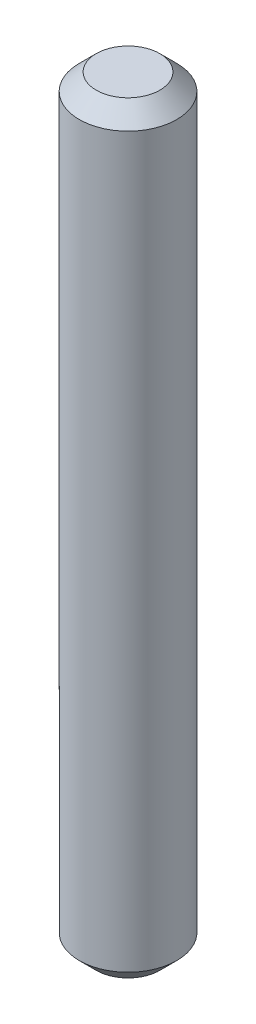
ISO-10303-21;
HEADER;
FILE_DESCRIPTION(('STEP AP214'),'2;1');
FILE_NAME('part.step','',(''),(''),'','','');
FILE_SCHEMA(('AUTOMOTIVE_DESIGN { 1 0 10303 214 1 1 1 1 }'));
ENDSEC;
DATA;
#1=APPLICATION_CONTEXT('core data for automotive mechanical design processes');
#2=APPLICATION_PROTOCOL_DEFINITION('international standard','automotive_design',2000,#1);
#3=PRODUCT_CONTEXT('',#1,'mechanical');
#4=PRODUCT('Part','Part','',(#3));
#5=PRODUCT_RELATED_PRODUCT_CATEGORY('part','',(#4));
#6=PRODUCT_DEFINITION_FORMATION('','',#4);
#7=PRODUCT_DEFINITION_CONTEXT('part definition',#1,'design');
#8=PRODUCT_DEFINITION('design','',#6,#7);
#9=PRODUCT_DEFINITION_SHAPE('','',#8);
#10=(LENGTH_UNIT() NAMED_UNIT(*) SI_UNIT(.MILLI.,.METRE.));
#11=(NAMED_UNIT(*) PLANE_ANGLE_UNIT() SI_UNIT($,.RADIAN.));
#12=(NAMED_UNIT(*) SI_UNIT($,.STERADIAN.) SOLID_ANGLE_UNIT());
#13=UNCERTAINTY_MEASURE_WITH_UNIT(LENGTH_MEASURE(1.E-05),#10,'distance_accuracy_value','');
#14=(GEOMETRIC_REPRESENTATION_CONTEXT(3) GLOBAL_UNCERTAINTY_ASSIGNED_CONTEXT((#13)) GLOBAL_UNIT_ASSIGNED_CONTEXT((#10,
#11,#12)) REPRESENTATION_CONTEXT('',''));
#15=CARTESIAN_POINT('',(0.,0.,0.));
#16=DIRECTION('',(0.,0.,1.));
#17=DIRECTION('',(1.,0.,0.));
#18=AXIS2_PLACEMENT_3D('',#15,#16,#17);
#19=CARTESIAN_POINT('',(0.,22.5,0.));
#20=DIRECTION('',(0.,-1.,0.));
#21=DIRECTION('',(0.,0.,-1.));
#22=AXIS2_PLACEMENT_3D('',#19,#20,#21);
#23=CYLINDRICAL_SURFACE('',#22,2.875);
#24=CARTESIAN_POINT('',(0.,21.5,0.));
#25=DIRECTION('',(0.,1.,0.));
#26=DIRECTION('',(0.,0.,1.));
#27=AXIS2_PLACEMENT_3D('',#24,#25,#26);
#28=CIRCLE('',#27,2.875);
#29=CARTESIAN_POINT('',(0.,21.5,-2.875));
#30=VERTEX_POINT('',#29);
#31=EDGE_CURVE('E49',#30,#30,#28,.F.);
#32=CARTESIAN_POINT('',(0.,-21.5,0.));
#33=DIRECTION('',(0.,1.,0.));
#34=DIRECTION('',(0.,0.,1.));
#35=AXIS2_PLACEMENT_3D('',#32,#33,#34);
#36=CIRCLE('',#35,2.875);
#37=CARTESIAN_POINT('',(0.,-21.5,-2.875));
#38=VERTEX_POINT('',#37);
#39=EDGE_CURVE('E56',#38,#38,#36,.T.);
#40=CARTESIAN_POINT('',(0.,21.5,-2.875));
#41=CARTESIAN_POINT('',(0.,21.0520833333333,-2.875));
#42=CARTESIAN_POINT('',(0.,20.6041666666667,-2.875));
#43=CARTESIAN_POINT('',(0.,19.7083333333334,-2.875));
#44=CARTESIAN_POINT('',(0.,19.2604166666667,-2.875));
#45=CARTESIAN_POINT('',(0.,18.3645833333333,-2.875));
#46=CARTESIAN_POINT('',(0.,17.9166666666667,-2.875));
#47=CARTESIAN_POINT('',(0.,17.0208333333334,-2.875));
#48=CARTESIAN_POINT('',(0.,16.5729166666667,-2.875));
#49=CARTESIAN_POINT('',(0.,15.6770833333334,-2.875));
#50=CARTESIAN_POINT('',(0.,15.2291666666667,-2.875));
#51=CARTESIAN_POINT('',(0.,14.3333333333334,-2.875));
#52=CARTESIAN_POINT('',(0.,13.8854166666667,-2.875));
#53=CARTESIAN_POINT('',(0.,12.9895833333334,-2.875));
#54=CARTESIAN_POINT('',(0.,12.5416666666667,-2.875));
#55=CARTESIAN_POINT('',(0.,11.6458333333334,-2.875));
#56=CARTESIAN_POINT('',(0.,11.1979166666667,-2.875));
#57=CARTESIAN_POINT('',(0.,10.3020833333334,-2.875));
#58=CARTESIAN_POINT('',(0.,9.85416666666669,-2.875));
#59=CARTESIAN_POINT('',(0.,8.95833333333336,-2.875));
#60=CARTESIAN_POINT('',(0.,8.51041666666669,-2.875));
#61=CARTESIAN_POINT('',(0.,7.61458333333336,-2.875));
#62=CARTESIAN_POINT('',(0.,7.16666666666669,-2.875));
#63=CARTESIAN_POINT('',(0.,6.27083333333336,-2.875));
#64=CARTESIAN_POINT('',(0.,5.82291666666669,-2.875));
#65=CARTESIAN_POINT('',(0.,4.92708333333336,-2.875));
#66=CARTESIAN_POINT('',(0.,4.47916666666669,-2.875));
#67=CARTESIAN_POINT('',(0.,3.58333333333336,-2.875));
#68=CARTESIAN_POINT('',(0.,3.13541666666669,-2.875));
#69=CARTESIAN_POINT('',(0.,2.23958333333336,-2.875));
#70=CARTESIAN_POINT('',(0.,1.79166666666669,-2.875));
#71=CARTESIAN_POINT('',(0.,0.895833333333358,-2.875));
#72=CARTESIAN_POINT('',(0.,0.447916666666691,-2.875));
#73=CARTESIAN_POINT('',(0.,-0.447916666666643,-2.875));
#74=CARTESIAN_POINT('',(0.,-0.89583333333331,-2.875));
#75=CARTESIAN_POINT('',(0.,-1.79166666666664,-2.875));
#76=CARTESIAN_POINT('',(0.,-2.23958333333331,-2.875));
#77=CARTESIAN_POINT('',(0.,-3.13541666666664,-2.875));
#78=CARTESIAN_POINT('',(0.,-3.58333333333331,-2.875));
#79=CARTESIAN_POINT('',(0.,-4.47916666666664,-2.875));
#80=CARTESIAN_POINT('',(0.,-4.92708333333331,-2.875));
#81=CARTESIAN_POINT('',(0.,-5.82291666666664,-2.875));
#82=CARTESIAN_POINT('',(0.,-6.27083333333331,-2.875));
#83=CARTESIAN_POINT('',(0.,-7.16666666666664,-2.875));
#84=CARTESIAN_POINT('',(0.,-7.61458333333331,-2.875));
#85=CARTESIAN_POINT('',(0.,-8.51041666666664,-2.875));
#86=CARTESIAN_POINT('',(0.,-8.9583333333333,-2.875));
#87=CARTESIAN_POINT('',(0.,-9.85416666666664,-2.875));
#88=CARTESIAN_POINT('',(0.,-10.3020833333333,-2.875));
#89=CARTESIAN_POINT('',(0.,-11.1979166666666,-2.875));
#90=CARTESIAN_POINT('',(0.,-11.6458333333333,-2.875));
#91=CARTESIAN_POINT('',(0.,-12.5416666666666,-2.875));
#92=CARTESIAN_POINT('',(0.,-12.9895833333333,-2.875));
#93=CARTESIAN_POINT('',(0.,-13.8854166666666,-2.875));
#94=CARTESIAN_POINT('',(0.,-14.3333333333333,-2.875));
#95=CARTESIAN_POINT('',(0.,-15.2291666666666,-2.875));
#96=CARTESIAN_POINT('',(0.,-15.6770833333333,-2.875));
#97=CARTESIAN_POINT('',(0.,-16.5729166666666,-2.875));
#98=CARTESIAN_POINT('',(0.,-17.0208333333333,-2.875));
#99=CARTESIAN_POINT('',(0.,-17.9166666666666,-2.875));
#100=CARTESIAN_POINT('',(0.,-18.3645833333333,-2.875));
#101=CARTESIAN_POINT('',(0.,-19.2604166666666,-2.875));
#102=CARTESIAN_POINT('',(0.,-19.7083333333333,-2.875));
#103=CARTESIAN_POINT('',(0.,-20.6041666666666,-2.875));
#104=CARTESIAN_POINT('',(0.,-21.0520833333333,-2.875));
#105=CARTESIAN_POINT('',(0.,-21.5,-2.875));
#106=B_SPLINE_CURVE_WITH_KNOTS('',3,(#40,#41,#42,#43,#44,#45,#46,#47,#48,#49,#50,#51,#52,#53,
#54,#55,#56,#57,#58,#59,#60,#61,#62,#63,#64,#65,#66,#67,#68,#69,#70,#71,#72,#73,#74,#75,#76,#77,
#78,#79,#80,#81,#82,#83,#84,#85,#86,#87,#88,#89,#90,#91,#92,#93,#94,#95,#96,#97,#98,#99,#100,
#101,#102,#103,#104,#105),.UNSPECIFIED.,.F.,.F.,(4,2,2,2,2,2,2,2,2,2,2,2,2,2,2,2,2,2,2,2,2,2,2,
2,2,2,2,2,2,2,2,2,4),(0.,1.34375,2.6875,4.03125,5.375,6.71875,8.06249999999999,9.40624999999999,
10.75,12.09375,13.4375,14.78125,16.125,17.46875,18.8125,20.15625,21.5,22.84375,24.1875,25.53125,
26.875,28.21875,29.5625,30.90625,32.25,33.59375,34.9375,36.28125,37.625,38.96875,40.3125,
41.65625,43.),.UNSPECIFIED.);
#107=EDGE_CURVE('BSEAM40',#30,#38,#106,.T.);
#108=ORIENTED_EDGE('',*,*,#31,.T.);
#109=ORIENTED_EDGE('',*,*,#39,.T.);
#110=ORIENTED_EDGE('',*,*,#107,.T.);
#111=ORIENTED_EDGE('',*,*,#107,.F.);
#112=EDGE_LOOP('',(#108,#110,#109,#111));
#113=FACE_BOUND('',#112,.T.);
#114=ADVANCED_FACE('F40',(#113),#23,.T.);
#115=CARTESIAN_POINT('',(0.,22.5,0.));
#116=DIRECTION('',(0.,1.,0.));
#117=DIRECTION('',(0.,0.,1.));
#118=AXIS2_PLACEMENT_3D('',#115,#116,#117);
#119=PLANE('',#118);
#120=CARTESIAN_POINT('',(0.,22.5,0.));
#121=DIRECTION('',(0.,1.,0.));
#122=DIRECTION('',(0.,0.,1.));
#123=AXIS2_PLACEMENT_3D('',#120,#121,#122);
#124=CIRCLE('',#123,1.87500000000002);
#125=CARTESIAN_POINT('',(0.,22.5,1.87500000000002));
#126=VERTEX_POINT('',#125);
#127=EDGE_CURVE('E60',#126,#126,#124,.T.);
#128=ORIENTED_EDGE('',*,*,#127,.T.);
#129=EDGE_LOOP('',(#128));
#130=FACE_BOUND('',#129,.T.);
#131=ADVANCED_FACE('F66',(#130),#119,.T.);
#132=CARTESIAN_POINT('',(0.,-22.5,0.));
#133=DIRECTION('',(0.,1.,0.));
#134=DIRECTION('',(0.,0.,1.));
#135=AXIS2_PLACEMENT_3D('',#132,#133,#134);
#136=PLANE('',#135);
#137=CARTESIAN_POINT('',(0.,-22.5,0.));
#138=DIRECTION('',(0.,1.,0.));
#139=DIRECTION('',(0.,0.,1.));
#140=AXIS2_PLACEMENT_3D('',#137,#138,#139);
#141=CIRCLE('',#140,1.87499999999996);
#142=CARTESIAN_POINT('',(0.,-22.5,1.87499999999996));
#143=VERTEX_POINT('',#142);
#144=EDGE_CURVE('E10',#143,#143,#141,.F.);
#145=ORIENTED_EDGE('',*,*,#144,.T.);
#146=EDGE_LOOP('',(#145));
#147=FACE_BOUND('',#146,.T.);
#148=ADVANCED_FACE('F70',(#147),#136,.F.);
#149=CARTESIAN_POINT('',(0.,22.5,0.));
#150=DIRECTION('',(0.,-1.,0.));
#151=DIRECTION('',(0.,0.,-1.));
#152=AXIS2_PLACEMENT_3D('',#149,#150,#151);
#153=CONICAL_SURFACE('',#152,1.87500000000002,0.785398163397447);
#154=ORIENTED_EDGE('',*,*,#31,.F.);
#155=EDGE_LOOP('',(#154));
#156=FACE_BOUND('',#155,.T.);
#157=ORIENTED_EDGE('',*,*,#127,.F.);
#158=EDGE_LOOP('',(#157));
#159=FACE_BOUND('',#158,.T.);
#160=ADVANCED_FACE('F68',(#156,#159),#153,.T.);
#161=CARTESIAN_POINT('',(0.,-21.5,0.));
#162=DIRECTION('',(0.,1.,0.));
#163=DIRECTION('',(0.,0.,1.));
#164=AXIS2_PLACEMENT_3D('',#161,#162,#163);
#165=CONICAL_SURFACE('',#164,2.875,0.785398163397449);
#166=ORIENTED_EDGE('',*,*,#144,.F.);
#167=EDGE_LOOP('',(#166));
#168=FACE_BOUND('',#167,.T.);
#169=ORIENTED_EDGE('',*,*,#39,.F.);
#170=EDGE_LOOP('',(#169));
#171=FACE_BOUND('',#170,.T.);
#172=ADVANCED_FACE('F43',(#168,#171),#165,.T.);
#173=CLOSED_SHELL('',(#114,#131,#148,#160,#172));
#174=MANIFOLD_SOLID_BREP('B2',#173);
#175=ADVANCED_BREP_SHAPE_REPRESENTATION('',(#18,#174),#14);
#176=SHAPE_DEFINITION_REPRESENTATION(#9,#175);
ENDSEC;
END-ISO-10303-21;
